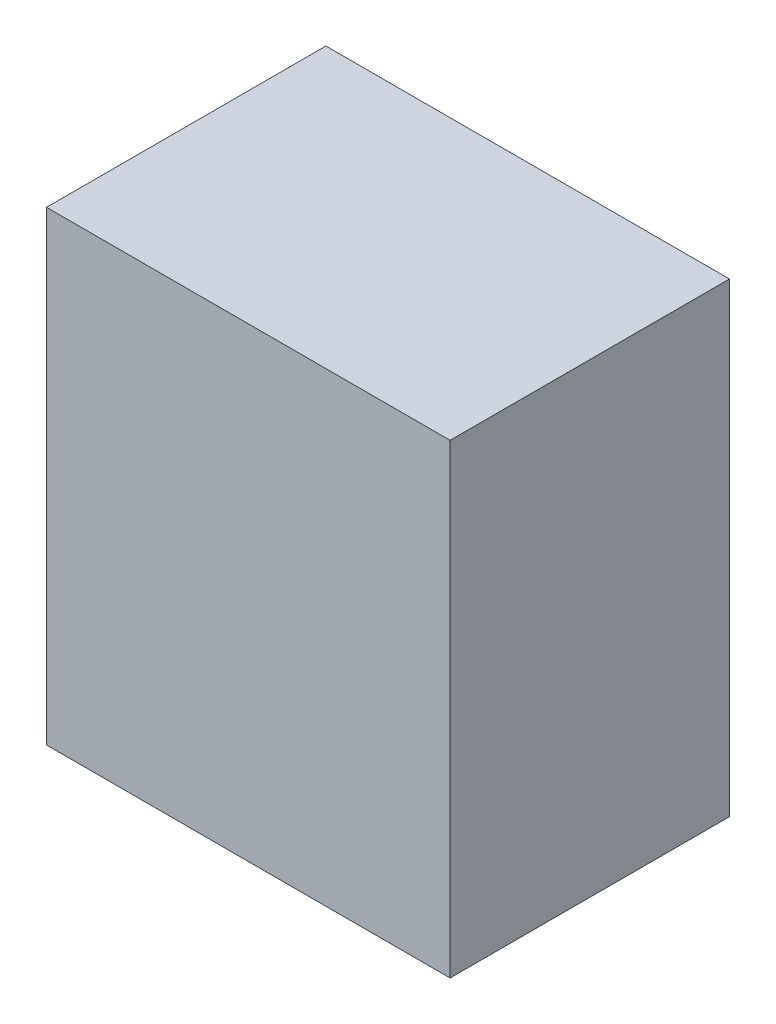
ISO-10303-21;
HEADER;
FILE_DESCRIPTION(('STEP AP214'),'2;1');
FILE_NAME('part.step','',(''),(''),'','','');
FILE_SCHEMA(('AUTOMOTIVE_DESIGN { 1 0 10303 214 1 1 1 1 }'));
ENDSEC;
DATA;
#1=APPLICATION_CONTEXT('core data for automotive mechanical design processes');
#2=APPLICATION_PROTOCOL_DEFINITION('international standard','automotive_design',2000,#1);
#3=PRODUCT_CONTEXT('',#1,'mechanical');
#4=PRODUCT('Part','Part','',(#3));
#5=PRODUCT_RELATED_PRODUCT_CATEGORY('part','',(#4));
#6=PRODUCT_DEFINITION_FORMATION('','',#4);
#7=PRODUCT_DEFINITION_CONTEXT('part definition',#1,'design');
#8=PRODUCT_DEFINITION('design','',#6,#7);
#9=PRODUCT_DEFINITION_SHAPE('','',#8);
#10=(LENGTH_UNIT() NAMED_UNIT(*) SI_UNIT(.MILLI.,.METRE.));
#11=(NAMED_UNIT(*) PLANE_ANGLE_UNIT() SI_UNIT($,.RADIAN.));
#12=(NAMED_UNIT(*) SI_UNIT($,.STERADIAN.) SOLID_ANGLE_UNIT());
#13=UNCERTAINTY_MEASURE_WITH_UNIT(LENGTH_MEASURE(1.E-05),#10,'distance_accuracy_value','');
#14=(GEOMETRIC_REPRESENTATION_CONTEXT(3) GLOBAL_UNCERTAINTY_ASSIGNED_CONTEXT((#13)) GLOBAL_UNIT_ASSIGNED_CONTEXT((#10,
#11,#12)) REPRESENTATION_CONTEXT('',''));
#15=CARTESIAN_POINT('',(0.,0.,0.));
#16=DIRECTION('',(0.,0.,1.));
#17=DIRECTION('',(1.,0.,0.));
#18=AXIS2_PLACEMENT_3D('',#15,#16,#17);
#19=CARTESIAN_POINT('',(380.,1400.,-300.));
#20=DIRECTION('',(-1.,0.,0.));
#21=DIRECTION('',(0.,0.,1.));
#22=AXIS2_PLACEMENT_3D('',#19,#20,#21);
#23=PLANE('',#22);
#24=DIRECTION('',(0.,-1.,0.));
#25=VECTOR('',#24,1.);
#26=CARTESIAN_POINT('',(380.,1400.,-120.));
#27=LINE('',#26,#25);
#28=CARTESIAN_POINT('',(380.,1700.,-120.));
#29=VERTEX_POINT('',#28);
#30=CARTESIAN_POINT('',(380.,1400.,-120.));
#31=VERTEX_POINT('',#30);
#32=EDGE_CURVE('E103',#29,#31,#27,.T.);
#33=ORIENTED_EDGE('',*,*,#32,.F.);
#34=DIRECTION('',(0.,0.,1.));
#35=VECTOR('',#34,1.);
#36=CARTESIAN_POINT('',(380.,1700.,-300.));
#37=LINE('',#36,#35);
#38=CARTESIAN_POINT('',(380.,1700.,-300.));
#39=VERTEX_POINT('',#38);
#40=EDGE_CURVE('E11',#39,#29,#37,.T.);
#41=ORIENTED_EDGE('',*,*,#40,.F.);
#42=DIRECTION('',(0.,-1.,0.));
#43=VECTOR('',#42,1.);
#44=CARTESIAN_POINT('',(380.,1400.,-300.));
#45=LINE('',#44,#43);
#46=CARTESIAN_POINT('',(380.,1400.,-300.));
#47=VERTEX_POINT('',#46);
#48=EDGE_CURVE('E97',#39,#47,#45,.T.);
#49=ORIENTED_EDGE('',*,*,#48,.T.);
#50=DIRECTION('',(0.,0.,1.));
#51=VECTOR('',#50,1.);
#52=CARTESIAN_POINT('',(380.,1400.,-300.));
#53=LINE('',#52,#51);
#54=EDGE_CURVE('E42',#47,#31,#53,.T.);
#55=ORIENTED_EDGE('',*,*,#54,.T.);
#56=EDGE_LOOP('',(#33,#41,#49,#55));
#57=FACE_BOUND('',#56,.T.);
#58=ADVANCED_FACE('F39',(#57),#23,.T.);
#59=CARTESIAN_POINT('',(380.,1700.,-300.));
#60=DIRECTION('',(0.,1.,0.));
#61=DIRECTION('',(0.,0.,1.));
#62=AXIS2_PLACEMENT_3D('',#59,#60,#61);
#63=PLANE('',#62);
#64=DIRECTION('',(-1.,0.,0.));
#65=VECTOR('',#64,1.);
#66=CARTESIAN_POINT('',(380.,1700.,-120.));
#67=LINE('',#66,#65);
#68=CARTESIAN_POINT('',(640.,1700.,-120.));
#69=VERTEX_POINT('',#68);
#70=EDGE_CURVE('E99',#69,#29,#67,.T.);
#71=ORIENTED_EDGE('',*,*,#70,.F.);
#72=DIRECTION('',(0.,0.,1.));
#73=VECTOR('',#72,1.);
#74=CARTESIAN_POINT('',(640.,1700.,-300.));
#75=LINE('',#74,#73);
#76=CARTESIAN_POINT('',(640.,1700.,-300.));
#77=VERTEX_POINT('',#76);
#78=EDGE_CURVE('E48',#77,#69,#75,.T.);
#79=ORIENTED_EDGE('',*,*,#78,.F.);
#80=DIRECTION('',(-1.,0.,0.));
#81=VECTOR('',#80,1.);
#82=CARTESIAN_POINT('',(380.,1700.,-300.));
#83=LINE('',#82,#81);
#84=EDGE_CURVE('E94',#77,#39,#83,.T.);
#85=ORIENTED_EDGE('',*,*,#84,.T.);
#86=ORIENTED_EDGE('',*,*,#40,.T.);
#87=EDGE_LOOP('',(#71,#79,#85,#86));
#88=FACE_BOUND('',#87,.T.);
#89=ADVANCED_FACE('F113',(#88),#63,.T.);
#90=CARTESIAN_POINT('',(640.,1400.,-300.));
#91=DIRECTION('',(1.,0.,0.));
#92=DIRECTION('',(0.,0.,-1.));
#93=AXIS2_PLACEMENT_3D('',#90,#91,#92);
#94=PLANE('',#93);
#95=DIRECTION('',(0.,1.,0.));
#96=VECTOR('',#95,1.);
#97=CARTESIAN_POINT('',(640.,1400.,-120.));
#98=LINE('',#97,#96);
#99=CARTESIAN_POINT('',(640.,1400.,-120.));
#100=VERTEX_POINT('',#99);
#101=EDGE_CURVE('E89',#100,#69,#98,.T.);
#102=ORIENTED_EDGE('',*,*,#101,.F.);
#103=DIRECTION('',(0.,0.,1.));
#104=VECTOR('',#103,1.);
#105=CARTESIAN_POINT('',(640.,1400.,-300.));
#106=LINE('',#105,#104);
#107=CARTESIAN_POINT('',(640.,1400.,-300.));
#108=VERTEX_POINT('',#107);
#109=EDGE_CURVE('E84',#108,#100,#106,.T.);
#110=ORIENTED_EDGE('',*,*,#109,.F.);
#111=DIRECTION('',(0.,1.,0.));
#112=VECTOR('',#111,1.);
#113=CARTESIAN_POINT('',(640.,1400.,-300.));
#114=LINE('',#113,#112);
#115=EDGE_CURVE('E87',#108,#77,#114,.T.);
#116=ORIENTED_EDGE('',*,*,#115,.T.);
#117=ORIENTED_EDGE('',*,*,#78,.T.);
#118=EDGE_LOOP('',(#102,#110,#116,#117));
#119=FACE_BOUND('',#118,.T.);
#120=ADVANCED_FACE('F86',(#119),#94,.T.);
#121=CARTESIAN_POINT('',(380.,1400.,-300.));
#122=DIRECTION('',(0.,-1.,0.));
#123=DIRECTION('',(0.,0.,-1.));
#124=AXIS2_PLACEMENT_3D('',#121,#122,#123);
#125=PLANE('',#124);
#126=DIRECTION('',(1.,0.,0.));
#127=VECTOR('',#126,1.);
#128=CARTESIAN_POINT('',(380.,1400.,-120.));
#129=LINE('',#128,#127);
#130=EDGE_CURVE('E106',#31,#100,#129,.T.);
#131=ORIENTED_EDGE('',*,*,#130,.F.);
#132=ORIENTED_EDGE('',*,*,#54,.F.);
#133=DIRECTION('',(1.,0.,0.));
#134=VECTOR('',#133,1.);
#135=CARTESIAN_POINT('',(380.,1400.,-300.));
#136=LINE('',#135,#134);
#137=EDGE_CURVE('E93',#47,#108,#136,.T.);
#138=ORIENTED_EDGE('',*,*,#137,.T.);
#139=ORIENTED_EDGE('',*,*,#109,.T.);
#140=EDGE_LOOP('',(#131,#132,#138,#139));
#141=FACE_BOUND('',#140,.T.);
#142=ADVANCED_FACE('F96',(#141),#125,.T.);
#143=CARTESIAN_POINT('',(0.,0.,-300.));
#144=DIRECTION('',(0.,0.,-1.));
#145=DIRECTION('',(-1.,0.,0.));
#146=AXIS2_PLACEMENT_3D('',#143,#144,#145);
#147=PLANE('',#146);
#148=ORIENTED_EDGE('',*,*,#48,.F.);
#149=ORIENTED_EDGE('',*,*,#84,.F.);
#150=ORIENTED_EDGE('',*,*,#115,.F.);
#151=ORIENTED_EDGE('',*,*,#137,.F.);
#152=EDGE_LOOP('',(#148,#149,#150,#151));
#153=FACE_BOUND('',#152,.T.);
#154=ADVANCED_FACE('F92',(#153),#147,.T.);
#155=CARTESIAN_POINT('',(0.,0.,-120.));
#156=DIRECTION('',(0.,0.,-1.));
#157=DIRECTION('',(-1.,0.,0.));
#158=AXIS2_PLACEMENT_3D('',#155,#156,#157);
#159=PLANE('',#158);
#160=ORIENTED_EDGE('',*,*,#32,.T.);
#161=ORIENTED_EDGE('',*,*,#130,.T.);
#162=ORIENTED_EDGE('',*,*,#101,.T.);
#163=ORIENTED_EDGE('',*,*,#70,.T.);
#164=EDGE_LOOP('',(#160,#161,#162,#163));
#165=FACE_BOUND('',#164,.T.);
#166=ADVANCED_FACE('F112',(#165),#159,.F.);
#167=CLOSED_SHELL('',(#58,#89,#120,#142,#154,#166));
#168=MANIFOLD_SOLID_BREP('B2',#167);
#169=ADVANCED_BREP_SHAPE_REPRESENTATION('',(#18,#168),#14);
#170=SHAPE_DEFINITION_REPRESENTATION(#9,#169);
ENDSEC;
END-ISO-10303-21;
